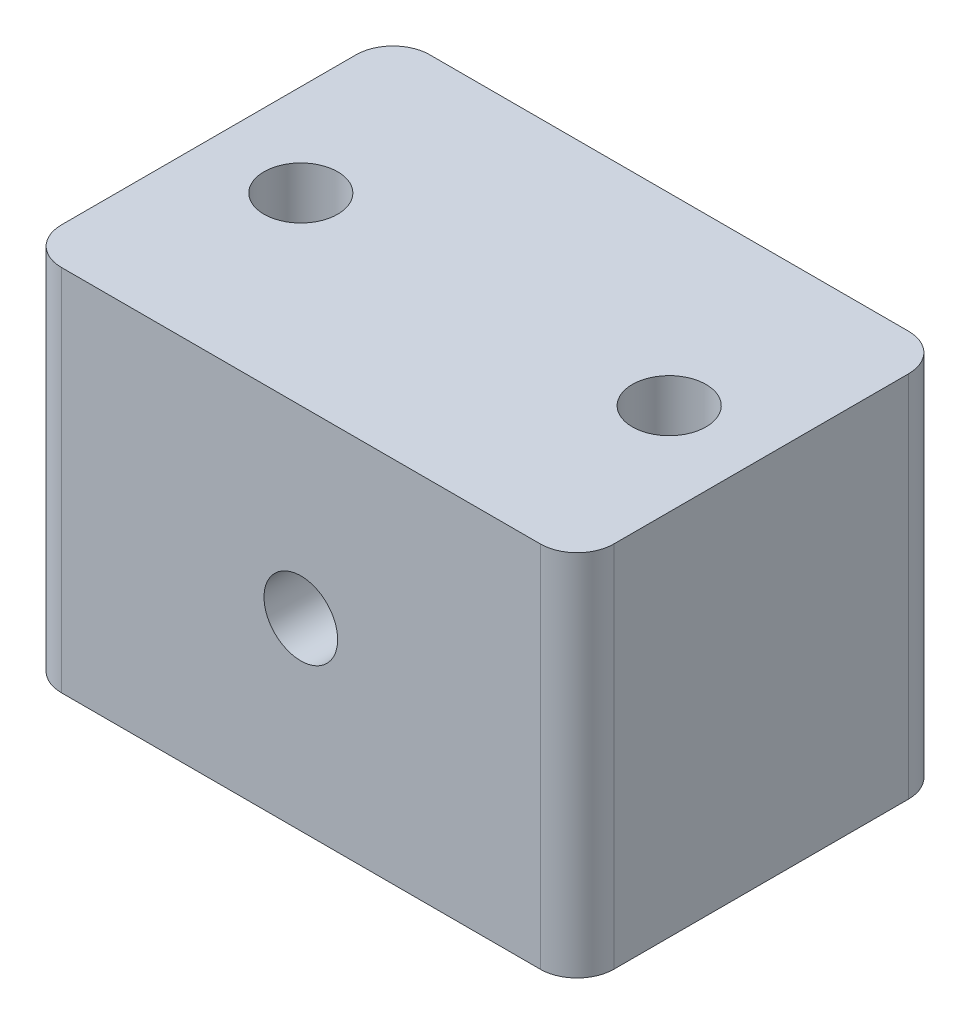
ISO-10303-21;
HEADER;
FILE_DESCRIPTION(('STEP AP214'),'2;1');
FILE_NAME('part.step','',(''),(''),'','','');
FILE_SCHEMA(('AUTOMOTIVE_DESIGN { 1 0 10303 214 1 1 1 1 }'));
ENDSEC;
DATA;
#1=APPLICATION_CONTEXT('core data for automotive mechanical design processes');
#2=APPLICATION_PROTOCOL_DEFINITION('international standard','automotive_design',2000,#1);
#3=PRODUCT_CONTEXT('',#1,'mechanical');
#4=PRODUCT('Part','Part','',(#3));
#5=PRODUCT_RELATED_PRODUCT_CATEGORY('part','',(#4));
#6=PRODUCT_DEFINITION_FORMATION('','',#4);
#7=PRODUCT_DEFINITION_CONTEXT('part definition',#1,'design');
#8=PRODUCT_DEFINITION('design','',#6,#7);
#9=PRODUCT_DEFINITION_SHAPE('','',#8);
#10=(LENGTH_UNIT() NAMED_UNIT(*) SI_UNIT(.MILLI.,.METRE.));
#11=(NAMED_UNIT(*) PLANE_ANGLE_UNIT() SI_UNIT($,.RADIAN.));
#12=(NAMED_UNIT(*) SI_UNIT($,.STERADIAN.) SOLID_ANGLE_UNIT());
#13=UNCERTAINTY_MEASURE_WITH_UNIT(LENGTH_MEASURE(1.E-05),#10,'distance_accuracy_value','');
#14=(GEOMETRIC_REPRESENTATION_CONTEXT(3) GLOBAL_UNCERTAINTY_ASSIGNED_CONTEXT((#13)) GLOBAL_UNIT_ASSIGNED_CONTEXT((#10,
#11,#12)) REPRESENTATION_CONTEXT('',''));
#15=CARTESIAN_POINT('',(0.,0.,0.));
#16=DIRECTION('',(0.,0.,1.));
#17=DIRECTION('',(1.,0.,0.));
#18=AXIS2_PLACEMENT_3D('',#15,#16,#17);
#19=CARTESIAN_POINT('',(-18.2220647818234,0.272312164086618,10.));
#20=DIRECTION('',(0.,0.,1.));
#21=DIRECTION('',(1.,0.,0.));
#22=AXIS2_PLACEMENT_3D('',#19,#20,#21);
#23=PLANE('',#22);
#24=DIRECTION('',(-1.,0.,0.));
#25=VECTOR('',#24,1.);
#26=CARTESIAN_POINT('',(-18.2220647818234,10.2723121640866,10.));
#27=LINE('',#26,#25);
#28=CARTESIAN_POINT('',(-4.22206478182345,10.2723121640866,10.));
#29=VERTEX_POINT('',#28);
#30=CARTESIAN_POINT('',(-17.2220647818234,10.2723121640866,10.));
#31=VERTEX_POINT('',#30);
#32=EDGE_CURVE('E159',#29,#31,#27,.T.);
#33=ORIENTED_EDGE('',*,*,#32,.T.);
#34=DIRECTION('',(0.,-1.,0.));
#35=VECTOR('',#34,1.);
#36=CARTESIAN_POINT('',(-17.2220647818234,0.272312164086618,10.));
#37=LINE('',#36,#35);
#38=CARTESIAN_POINT('',(-17.2220647818234,0.272312164086618,10.));
#39=VERTEX_POINT('',#38);
#40=EDGE_CURVE('E144',#31,#39,#37,.T.);
#41=ORIENTED_EDGE('',*,*,#40,.T.);
#42=DIRECTION('',(1.,0.,0.));
#43=VECTOR('',#42,1.);
#44=CARTESIAN_POINT('',(-18.2220647818234,0.272312164086618,10.));
#45=LINE('',#44,#43);
#46=CARTESIAN_POINT('',(-4.22206478182345,0.272312164086618,10.));
#47=VERTEX_POINT('',#46);
#48=EDGE_CURVE('E103',#39,#47,#45,.T.);
#49=ORIENTED_EDGE('',*,*,#48,.T.);
#50=DIRECTION('',(0.,1.,0.));
#51=VECTOR('',#50,1.);
#52=CARTESIAN_POINT('',(-4.22206478182345,10.2723121640866,10.));
#53=LINE('',#52,#51);
#54=EDGE_CURVE('E141',#47,#29,#53,.T.);
#55=ORIENTED_EDGE('',*,*,#54,.T.);
#56=EDGE_LOOP('',(#33,#41,#49,#55));
#57=FACE_BOUND('',#56,.T.);
#58=CARTESIAN_POINT('',(-10.7220647818235,5.27231216408662,10.));
#59=DIRECTION('',(0.,0.,1.));
#60=DIRECTION('',(1.,0.,0.));
#61=AXIS2_PLACEMENT_3D('',#58,#59,#60);
#62=CIRCLE('',#61,1.);
#63=CARTESIAN_POINT('',(-9.72206478182345,5.27231216408662,10.));
#64=VERTEX_POINT('',#63);
#65=EDGE_CURVE('E171',#64,#64,#62,.T.);
#66=ORIENTED_EDGE('',*,*,#65,.F.);
#67=EDGE_LOOP('',(#66));
#68=FACE_BOUND('',#67,.T.);
#69=ADVANCED_FACE('F32',(#57,#68),#23,.T.);
#70=CARTESIAN_POINT('',(-18.2220647818234,0.272312164086618,0.));
#71=DIRECTION('',(0.,0.,1.));
#72=DIRECTION('',(1.,0.,0.));
#73=AXIS2_PLACEMENT_3D('',#70,#71,#72);
#74=PLANE('',#73);
#75=DIRECTION('',(1.,0.,0.));
#76=VECTOR('',#75,1.);
#77=CARTESIAN_POINT('',(-18.2220647818234,0.272312164086618,0.));
#78=LINE('',#77,#76);
#79=CARTESIAN_POINT('',(-17.2220647818234,0.272312164086618,0.));
#80=VERTEX_POINT('',#79);
#81=CARTESIAN_POINT('',(-4.22206478182345,0.272312164086618,0.));
#82=VERTEX_POINT('',#81);
#83=EDGE_CURVE('E169',#80,#82,#78,.T.);
#84=ORIENTED_EDGE('',*,*,#83,.F.);
#85=DIRECTION('',(0.,-1.,0.));
#86=VECTOR('',#85,1.);
#87=CARTESIAN_POINT('',(-17.2220647818234,0.272312164086618,0.));
#88=LINE('',#87,#86);
#89=CARTESIAN_POINT('',(-17.2220647818234,10.2723121640866,0.));
#90=VERTEX_POINT('',#89);
#91=EDGE_CURVE('E134',#80,#90,#88,.F.);
#92=ORIENTED_EDGE('',*,*,#91,.T.);
#93=DIRECTION('',(-1.,0.,0.));
#94=VECTOR('',#93,1.);
#95=CARTESIAN_POINT('',(-18.2220647818234,10.2723121640866,0.));
#96=LINE('',#95,#94);
#97=CARTESIAN_POINT('',(-4.22206478182345,10.2723121640866,0.));
#98=VERTEX_POINT('',#97);
#99=EDGE_CURVE('E165',#98,#90,#96,.T.);
#100=ORIENTED_EDGE('',*,*,#99,.F.);
#101=DIRECTION('',(0.,1.,0.));
#102=VECTOR('',#101,1.);
#103=CARTESIAN_POINT('',(-4.22206478182345,0.27231216408662,0.));
#104=LINE('',#103,#102);
#105=EDGE_CURVE('E132',#98,#82,#104,.F.);
#106=ORIENTED_EDGE('',*,*,#105,.T.);
#107=EDGE_LOOP('',(#84,#92,#100,#106));
#108=FACE_BOUND('',#107,.T.);
#109=CARTESIAN_POINT('',(-10.7220647818235,5.27231216408662,0.));
#110=DIRECTION('',(0.,0.,1.));
#111=DIRECTION('',(1.,0.,0.));
#112=AXIS2_PLACEMENT_3D('',#109,#110,#111);
#113=CIRCLE('',#112,1.);
#114=CARTESIAN_POINT('',(-9.72206478182345,5.27231216408662,0.));
#115=VERTEX_POINT('',#114);
#116=EDGE_CURVE('E235',#115,#115,#113,.T.);
#117=ORIENTED_EDGE('',*,*,#116,.T.);
#118=EDGE_LOOP('',(#117));
#119=FACE_BOUND('',#118,.T.);
#120=ADVANCED_FACE('F177',(#108,#119),#74,.F.);
#121=CARTESIAN_POINT('',(-18.2220647818234,10.2723121640866,10.));
#122=DIRECTION('',(1.,0.,0.));
#123=DIRECTION('',(0.,1.,0.));
#124=AXIS2_PLACEMENT_3D('',#121,#122,#123);
#125=PLANE('',#124);
#126=DIRECTION('',(0.,0.,-1.));
#127=VECTOR('',#126,1.);
#128=CARTESIAN_POINT('',(-18.2220647818234,10.2723121640866,10.));
#129=LINE('',#128,#127);
#130=CARTESIAN_POINT('',(-18.2220647818234,10.2723121640866,9.));
#131=VERTEX_POINT('',#130);
#132=CARTESIAN_POINT('',(-18.2220647818234,10.2723121640866,0.999999999999999));
#133=VERTEX_POINT('',#132);
#134=EDGE_CURVE('E162',#131,#133,#129,.T.);
#135=ORIENTED_EDGE('',*,*,#134,.T.);
#136=DIRECTION('',(0.,-1.,0.));
#137=VECTOR('',#136,1.);
#138=CARTESIAN_POINT('',(-18.2220647818234,10.2723121640866,0.999999999999999));
#139=LINE('',#138,#137);
#140=CARTESIAN_POINT('',(-18.2220647818234,0.272312164086618,0.999999999999999));
#141=VERTEX_POINT('',#140);
#142=EDGE_CURVE('E118',#133,#141,#139,.T.);
#143=ORIENTED_EDGE('',*,*,#142,.T.);
#144=DIRECTION('',(0.,0.,-1.));
#145=VECTOR('',#144,1.);
#146=CARTESIAN_POINT('',(-18.2220647818234,0.272312164086618,10.));
#147=LINE('',#146,#145);
#148=CARTESIAN_POINT('',(-18.2220647818234,0.272312164086618,9.));
#149=VERTEX_POINT('',#148);
#150=EDGE_CURVE('E101',#149,#141,#147,.T.);
#151=ORIENTED_EDGE('',*,*,#150,.F.);
#152=DIRECTION('',(0.,-1.,0.));
#153=VECTOR('',#152,1.);
#154=CARTESIAN_POINT('',(-18.2220647818234,10.2723121640866,9.));
#155=LINE('',#154,#153);
#156=EDGE_CURVE('E115',#149,#131,#155,.F.);
#157=ORIENTED_EDGE('',*,*,#156,.T.);
#158=EDGE_LOOP('',(#135,#143,#151,#157));
#159=FACE_BOUND('',#158,.T.);
#160=ADVANCED_FACE('F114',(#159),#125,.F.);
#161=CARTESIAN_POINT('',(-18.2220647818234,0.272312164086618,10.));
#162=DIRECTION('',(0.,1.,0.));
#163=DIRECTION('',(0.,0.,1.));
#164=AXIS2_PLACEMENT_3D('',#161,#162,#163);
#165=PLANE('',#164);
#166=CARTESIAN_POINT('',(-5.72206478182345,0.272312164086618,5.));
#167=DIRECTION('',(0.,1.,0.));
#168=DIRECTION('',(0.,0.,1.));
#169=AXIS2_PLACEMENT_3D('',#166,#167,#168);
#170=CIRCLE('',#169,1.);
#171=CARTESIAN_POINT('',(-5.72206478182345,0.272312164086618,6.));
#172=VERTEX_POINT('',#171);
#173=EDGE_CURVE('E224',#172,#172,#170,.T.);
#174=ORIENTED_EDGE('',*,*,#173,.T.);
#175=EDGE_LOOP('',(#174));
#176=FACE_BOUND('',#175,.T.);
#177=CARTESIAN_POINT('',(-15.7220647818235,0.272312164086618,5.));
#178=DIRECTION('',(0.,1.,0.));
#179=DIRECTION('',(0.,0.,1.));
#180=AXIS2_PLACEMENT_3D('',#177,#178,#179);
#181=CIRCLE('',#180,1.);
#182=CARTESIAN_POINT('',(-15.7220647818235,0.272312164086618,6.));
#183=VERTEX_POINT('',#182);
#184=EDGE_CURVE('E232',#183,#183,#181,.T.);
#185=ORIENTED_EDGE('',*,*,#184,.T.);
#186=EDGE_LOOP('',(#185));
#187=FACE_BOUND('',#186,.T.);
#188=ORIENTED_EDGE('',*,*,#150,.T.);
#189=CARTESIAN_POINT('',(-17.2220647818234,0.272312164086618,0.999999999999999));
#190=DIRECTION('',(0.,1.,0.));
#191=DIRECTION('',(0.,0.,1.));
#192=AXIS2_PLACEMENT_3D('',#189,#190,#191);
#193=CIRCLE('',#192,1.);
#194=EDGE_CURVE('E108',#141,#80,#193,.F.);
#195=ORIENTED_EDGE('',*,*,#194,.T.);
#196=ORIENTED_EDGE('',*,*,#83,.T.);
#197=CARTESIAN_POINT('',(-4.22206478182345,0.272312164086618,0.999999999999999));
#198=DIRECTION('',(0.,1.,0.));
#199=DIRECTION('',(0.,0.,1.));
#200=AXIS2_PLACEMENT_3D('',#197,#198,#199);
#201=CIRCLE('',#200,1.);
#202=CARTESIAN_POINT('',(-3.22206478182345,0.272312164086618,0.999999999999999));
#203=VERTEX_POINT('',#202);
#204=EDGE_CURVE('E109',#82,#203,#201,.F.);
#205=ORIENTED_EDGE('',*,*,#204,.T.);
#206=DIRECTION('',(0.,0.,-1.));
#207=VECTOR('',#206,1.);
#208=CARTESIAN_POINT('',(-3.22206478182345,0.272312164086618,10.));
#209=LINE('',#208,#207);
#210=CARTESIAN_POINT('',(-3.22206478182345,0.272312164086618,9.));
#211=VERTEX_POINT('',#210);
#212=EDGE_CURVE('E119',#211,#203,#209,.T.);
#213=ORIENTED_EDGE('',*,*,#212,.F.);
#214=CARTESIAN_POINT('',(-4.22206478182345,0.272312164086618,9.));
#215=DIRECTION('',(0.,1.,0.));
#216=DIRECTION('',(0.,0.,1.));
#217=AXIS2_PLACEMENT_3D('',#214,#215,#216);
#218=CIRCLE('',#217,1.);
#219=EDGE_CURVE('E125',#211,#47,#218,.F.);
#220=ORIENTED_EDGE('',*,*,#219,.T.);
#221=ORIENTED_EDGE('',*,*,#48,.F.);
#222=CARTESIAN_POINT('',(-17.2220647818234,0.272312164086618,9.));
#223=DIRECTION('',(0.,1.,0.));
#224=DIRECTION('',(0.,0.,1.));
#225=AXIS2_PLACEMENT_3D('',#222,#223,#224);
#226=CIRCLE('',#225,1.);
#227=EDGE_CURVE('E98',#39,#149,#226,.F.);
#228=ORIENTED_EDGE('',*,*,#227,.T.);
#229=EDGE_LOOP('',(#188,#195,#196,#205,#213,#220,#221,#228));
#230=FACE_BOUND('',#229,.T.);
#231=ADVANCED_FACE('F100',(#176,#187,#230),#165,.F.);
#232=CARTESIAN_POINT('',(-3.22206478182345,10.2723121640866,10.));
#233=DIRECTION('',(-1.,0.,0.));
#234=DIRECTION('',(0.,-1.,0.));
#235=AXIS2_PLACEMENT_3D('',#232,#233,#234);
#236=PLANE('',#235);
#237=ORIENTED_EDGE('',*,*,#212,.T.);
#238=DIRECTION('',(0.,1.,0.));
#239=VECTOR('',#238,1.);
#240=CARTESIAN_POINT('',(-3.22206478182345,10.2723121640866,0.999999999999999));
#241=LINE('',#240,#239);
#242=CARTESIAN_POINT('',(-3.22206478182345,10.2723121640866,0.999999999999999));
#243=VERTEX_POINT('',#242);
#244=EDGE_CURVE('E11',#203,#243,#241,.T.);
#245=ORIENTED_EDGE('',*,*,#244,.T.);
#246=DIRECTION('',(0.,0.,-1.));
#247=VECTOR('',#246,1.);
#248=CARTESIAN_POINT('',(-3.22206478182345,10.2723121640866,10.));
#249=LINE('',#248,#247);
#250=CARTESIAN_POINT('',(-3.22206478182345,10.2723121640866,9.));
#251=VERTEX_POINT('',#250);
#252=EDGE_CURVE('E150',#251,#243,#249,.T.);
#253=ORIENTED_EDGE('',*,*,#252,.F.);
#254=DIRECTION('',(0.,1.,0.));
#255=VECTOR('',#254,1.);
#256=CARTESIAN_POINT('',(-3.22206478182345,0.272312164086618,9.));
#257=LINE('',#256,#255);
#258=EDGE_CURVE('E40',#251,#211,#257,.F.);
#259=ORIENTED_EDGE('',*,*,#258,.T.);
#260=EDGE_LOOP('',(#237,#245,#253,#259));
#261=FACE_BOUND('',#260,.T.);
#262=ADVANCED_FACE('F149',(#261),#236,.F.);
#263=CARTESIAN_POINT('',(-18.2220647818234,10.2723121640866,10.));
#264=DIRECTION('',(0.,-1.,0.));
#265=DIRECTION('',(0.,0.,-1.));
#266=AXIS2_PLACEMENT_3D('',#263,#264,#265);
#267=PLANE('',#266);
#268=CARTESIAN_POINT('',(-5.72206478182345,10.2723121640866,5.));
#269=DIRECTION('',(0.,1.,0.));
#270=DIRECTION('',(0.,0.,1.));
#271=AXIS2_PLACEMENT_3D('',#268,#269,#270);
#272=CIRCLE('',#271,1.);
#273=CARTESIAN_POINT('',(-5.72206478182345,10.2723121640866,6.));
#274=VERTEX_POINT('',#273);
#275=EDGE_CURVE('E227',#274,#274,#272,.T.);
#276=ORIENTED_EDGE('',*,*,#275,.F.);
#277=EDGE_LOOP('',(#276));
#278=FACE_BOUND('',#277,.T.);
#279=CARTESIAN_POINT('',(-15.7220647818235,10.2723121640866,5.));
#280=DIRECTION('',(0.,1.,0.));
#281=DIRECTION('',(0.,0.,1.));
#282=AXIS2_PLACEMENT_3D('',#279,#280,#281);
#283=CIRCLE('',#282,1.);
#284=CARTESIAN_POINT('',(-15.7220647818235,10.2723121640866,6.));
#285=VERTEX_POINT('',#284);
#286=EDGE_CURVE('E229',#285,#285,#283,.T.);
#287=ORIENTED_EDGE('',*,*,#286,.F.);
#288=EDGE_LOOP('',(#287));
#289=FACE_BOUND('',#288,.T.);
#290=ORIENTED_EDGE('',*,*,#99,.T.);
#291=CARTESIAN_POINT('',(-17.2220647818234,10.2723121640866,0.999999999999999));
#292=DIRECTION('',(0.,-1.,0.));
#293=DIRECTION('',(0.,0.,-1.));
#294=AXIS2_PLACEMENT_3D('',#291,#292,#293);
#295=CIRCLE('',#294,1.);
#296=EDGE_CURVE('E139',#90,#133,#295,.F.);
#297=ORIENTED_EDGE('',*,*,#296,.T.);
#298=ORIENTED_EDGE('',*,*,#134,.F.);
#299=CARTESIAN_POINT('',(-17.2220647818234,10.2723121640866,9.));
#300=DIRECTION('',(0.,-1.,0.));
#301=DIRECTION('',(0.,0.,-1.));
#302=AXIS2_PLACEMENT_3D('',#299,#300,#301);
#303=CIRCLE('',#302,1.);
#304=EDGE_CURVE('E123',#131,#31,#303,.F.);
#305=ORIENTED_EDGE('',*,*,#304,.T.);
#306=ORIENTED_EDGE('',*,*,#32,.F.);
#307=CARTESIAN_POINT('',(-4.22206478182345,10.2723121640866,9.));
#308=DIRECTION('',(0.,-1.,0.));
#309=DIRECTION('',(0.,0.,-1.));
#310=AXIS2_PLACEMENT_3D('',#307,#308,#309);
#311=CIRCLE('',#310,1.);
#312=EDGE_CURVE('E54',#29,#251,#311,.F.);
#313=ORIENTED_EDGE('',*,*,#312,.T.);
#314=ORIENTED_EDGE('',*,*,#252,.T.);
#315=CARTESIAN_POINT('',(-4.22206478182345,10.2723121640866,0.999999999999999));
#316=DIRECTION('',(0.,-1.,0.));
#317=DIRECTION('',(0.,0.,-1.));
#318=AXIS2_PLACEMENT_3D('',#315,#316,#317);
#319=CIRCLE('',#318,1.);
#320=EDGE_CURVE('E47',#243,#98,#319,.F.);
#321=ORIENTED_EDGE('',*,*,#320,.T.);
#322=EDGE_LOOP('',(#290,#297,#298,#305,#306,#313,#314,#321));
#323=FACE_BOUND('',#322,.T.);
#324=ADVANCED_FACE('F161',(#278,#289,#323),#267,.F.);
#325=CARTESIAN_POINT('',(-10.7220647818235,5.27231216408662,10.));
#326=DIRECTION('',(0.,0.,-1.));
#327=DIRECTION('',(-1.,0.,0.));
#328=AXIS2_PLACEMENT_3D('',#325,#326,#327);
#329=CYLINDRICAL_SURFACE('',#328,1.);
#330=ORIENTED_EDGE('',*,*,#65,.T.);
#331=EDGE_LOOP('',(#330));
#332=FACE_BOUND('',#331,.T.);
#333=ORIENTED_EDGE('',*,*,#116,.F.);
#334=EDGE_LOOP('',(#333));
#335=FACE_BOUND('',#334,.T.);
#336=ADVANCED_FACE('F195',(#332,#335),#329,.F.);
#337=CARTESIAN_POINT('',(-15.7220647818235,0.272312164086618,5.));
#338=DIRECTION('',(0.,1.,0.));
#339=DIRECTION('',(0.,0.,1.));
#340=AXIS2_PLACEMENT_3D('',#337,#338,#339);
#341=CYLINDRICAL_SURFACE('',#340,1.);
#342=ORIENTED_EDGE('',*,*,#184,.F.);
#343=EDGE_LOOP('',(#342));
#344=FACE_BOUND('',#343,.T.);
#345=ORIENTED_EDGE('',*,*,#286,.T.);
#346=EDGE_LOOP('',(#345));
#347=FACE_BOUND('',#346,.T.);
#348=ADVANCED_FACE('F214',(#344,#347),#341,.F.);
#349=CARTESIAN_POINT('',(-5.72206478182345,0.272312164086618,5.));
#350=DIRECTION('',(0.,1.,0.));
#351=DIRECTION('',(0.,0.,1.));
#352=AXIS2_PLACEMENT_3D('',#349,#350,#351);
#353=CYLINDRICAL_SURFACE('',#352,1.);
#354=ORIENTED_EDGE('',*,*,#173,.F.);
#355=EDGE_LOOP('',(#354));
#356=FACE_BOUND('',#355,.T.);
#357=ORIENTED_EDGE('',*,*,#275,.T.);
#358=EDGE_LOOP('',(#357));
#359=FACE_BOUND('',#358,.T.);
#360=ADVANCED_FACE('F209',(#356,#359),#353,.F.);
#361=CARTESIAN_POINT('',(-17.2220647818234,10.2723121640866,0.999999999999999));
#362=DIRECTION('',(0.,-1.,0.));
#363=DIRECTION('',(1.,0.,0.));
#364=AXIS2_PLACEMENT_3D('',#361,#362,#363);
#365=CYLINDRICAL_SURFACE('',#364,1.);
#366=ORIENTED_EDGE('',*,*,#296,.F.);
#367=ORIENTED_EDGE('',*,*,#91,.F.);
#368=ORIENTED_EDGE('',*,*,#194,.F.);
#369=ORIENTED_EDGE('',*,*,#142,.F.);
#370=EDGE_LOOP('',(#366,#367,#368,#369));
#371=FACE_BOUND('',#370,.T.);
#372=ADVANCED_FACE('F186',(#371),#365,.T.);
#373=CARTESIAN_POINT('',(-17.2220647818234,0.272312164086618,9.));
#374=DIRECTION('',(0.,1.,0.));
#375=DIRECTION('',(-1.,0.,0.));
#376=AXIS2_PLACEMENT_3D('',#373,#374,#375);
#377=CYLINDRICAL_SURFACE('',#376,1.);
#378=ORIENTED_EDGE('',*,*,#304,.F.);
#379=ORIENTED_EDGE('',*,*,#156,.F.);
#380=ORIENTED_EDGE('',*,*,#227,.F.);
#381=ORIENTED_EDGE('',*,*,#40,.F.);
#382=EDGE_LOOP('',(#378,#379,#380,#381));
#383=FACE_BOUND('',#382,.T.);
#384=ADVANCED_FACE('F122',(#383),#377,.T.);
#385=CARTESIAN_POINT('',(-4.22206478182345,10.2723121640866,0.999999999999999));
#386=DIRECTION('',(0.,1.,0.));
#387=DIRECTION('',(-1.,0.,0.));
#388=AXIS2_PLACEMENT_3D('',#385,#386,#387);
#389=CYLINDRICAL_SURFACE('',#388,1.);
#390=ORIENTED_EDGE('',*,*,#204,.F.);
#391=ORIENTED_EDGE('',*,*,#105,.F.);
#392=ORIENTED_EDGE('',*,*,#320,.F.);
#393=ORIENTED_EDGE('',*,*,#244,.F.);
#394=EDGE_LOOP('',(#390,#391,#392,#393));
#395=FACE_BOUND('',#394,.T.);
#396=ADVANCED_FACE('F180',(#395),#389,.T.);
#397=CARTESIAN_POINT('',(-4.22206478182345,0.27231216408662,9.));
#398=DIRECTION('',(0.,-1.,0.));
#399=DIRECTION('',(1.,0.,0.));
#400=AXIS2_PLACEMENT_3D('',#397,#398,#399);
#401=CYLINDRICAL_SURFACE('',#400,1.);
#402=ORIENTED_EDGE('',*,*,#219,.F.);
#403=ORIENTED_EDGE('',*,*,#258,.F.);
#404=ORIENTED_EDGE('',*,*,#312,.F.);
#405=ORIENTED_EDGE('',*,*,#54,.F.);
#406=EDGE_LOOP('',(#402,#403,#404,#405));
#407=FACE_BOUND('',#406,.T.);
#408=ADVANCED_FACE('F34',(#407),#401,.T.);
#409=CLOSED_SHELL('',(#69,#120,#160,#231,#262,#324,#336,#348,#360,#372,#384,#396,#408));
#410=MANIFOLD_SOLID_BREP('B2',#409);
#411=ADVANCED_BREP_SHAPE_REPRESENTATION('',(#18,#410),#14);
#412=SHAPE_DEFINITION_REPRESENTATION(#9,#411);
ENDSEC;
END-ISO-10303-21;
